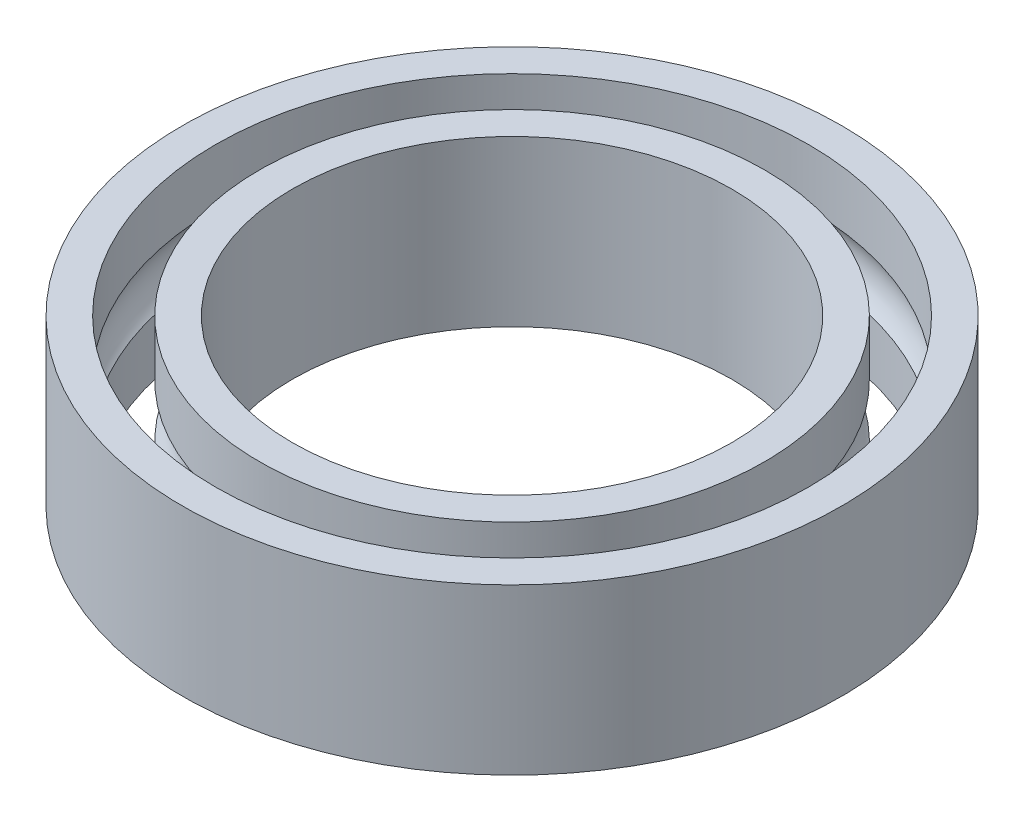
ISO-10303-21;
HEADER;
FILE_DESCRIPTION(('STEP AP214'),'2;1');
FILE_NAME('part.step','',(''),(''),'','','');
FILE_SCHEMA(('AUTOMOTIVE_DESIGN { 1 0 10303 214 1 1 1 1 }'));
ENDSEC;
DATA;
#1=APPLICATION_CONTEXT('core data for automotive mechanical design processes');
#2=APPLICATION_PROTOCOL_DEFINITION('international standard','automotive_design',2000,#1);
#3=PRODUCT_CONTEXT('',#1,'mechanical');
#4=PRODUCT('Part','Part','',(#3));
#5=PRODUCT_RELATED_PRODUCT_CATEGORY('part','',(#4));
#6=PRODUCT_DEFINITION_FORMATION('','',#4);
#7=PRODUCT_DEFINITION_CONTEXT('part definition',#1,'design');
#8=PRODUCT_DEFINITION('design','',#6,#7);
#9=PRODUCT_DEFINITION_SHAPE('','',#8);
#10=(LENGTH_UNIT() NAMED_UNIT(*) SI_UNIT(.MILLI.,.METRE.));
#11=(NAMED_UNIT(*) PLANE_ANGLE_UNIT() SI_UNIT($,.RADIAN.));
#12=(NAMED_UNIT(*) SI_UNIT($,.STERADIAN.) SOLID_ANGLE_UNIT());
#13=UNCERTAINTY_MEASURE_WITH_UNIT(LENGTH_MEASURE(1.E-05),#10,'distance_accuracy_value','');
#14=(GEOMETRIC_REPRESENTATION_CONTEXT(3) GLOBAL_UNCERTAINTY_ASSIGNED_CONTEXT((#13)) GLOBAL_UNIT_ASSIGNED_CONTEXT((#10,
#11,#12)) REPRESENTATION_CONTEXT('',''));
#15=CARTESIAN_POINT('',(0.,0.,0.));
#16=DIRECTION('',(0.,0.,1.));
#17=DIRECTION('',(1.,0.,0.));
#18=AXIS2_PLACEMENT_3D('',#15,#16,#17);
#19=CARTESIAN_POINT('',(0.,-7.4169874783919,0.));
#20=DIRECTION('',(0.,-1.,0.));
#21=DIRECTION('',(0.,0.,-1.));
#22=AXIS2_PLACEMENT_3D('',#19,#20,#21);
#23=CYLINDRICAL_SURFACE('',#22,4.);
#24=CARTESIAN_POINT('',(0.,-1.5,0.));
#25=DIRECTION('',(0.,-1.,0.));
#26=DIRECTION('',(0.,0.,-1.));
#27=AXIS2_PLACEMENT_3D('',#24,#25,#26);
#28=CIRCLE('',#27,4.);
#29=CARTESIAN_POINT('',(0.,-1.5,-4.));
#30=VERTEX_POINT('',#29);
#31=EDGE_CURVE('E11',#30,#30,#28,.T.);
#32=ORIENTED_EDGE('',*,*,#31,.T.);
#33=EDGE_LOOP('',(#32));
#34=FACE_BOUND('',#33,.T.);
#35=CARTESIAN_POINT('',(0.,1.5,0.));
#36=DIRECTION('',(0.,-1.,0.));
#37=DIRECTION('',(0.,0.,-1.));
#38=AXIS2_PLACEMENT_3D('',#35,#36,#37);
#39=CIRCLE('',#38,4.);
#40=CARTESIAN_POINT('',(0.,1.5,-4.));
#41=VERTEX_POINT('',#40);
#42=EDGE_CURVE('E67',#41,#41,#39,.T.);
#43=ORIENTED_EDGE('',*,*,#42,.F.);
#44=EDGE_LOOP('',(#43));
#45=FACE_BOUND('',#44,.T.);
#46=ADVANCED_FACE('F45',(#34,#45),#23,.F.);
#47=CARTESIAN_POINT('',(4.,-1.5,0.));
#48=DIRECTION('',(0.,-1.,0.));
#49=DIRECTION('',(0.,0.,-1.));
#50=AXIS2_PLACEMENT_3D('',#47,#48,#49);
#51=PLANE('',#50);
#52=CARTESIAN_POINT('',(0.,-1.5,0.));
#53=DIRECTION('',(0.,-1.,0.));
#54=DIRECTION('',(0.,0.,-1.));
#55=AXIS2_PLACEMENT_3D('',#52,#53,#54);
#56=CIRCLE('',#55,4.6);
#57=CARTESIAN_POINT('',(0.,-1.5,-4.6));
#58=VERTEX_POINT('',#57);
#59=EDGE_CURVE('E51',#58,#58,#56,.T.);
#60=ORIENTED_EDGE('',*,*,#59,.T.);
#61=EDGE_LOOP('',(#60));
#62=FACE_BOUND('',#61,.T.);
#63=ORIENTED_EDGE('',*,*,#31,.F.);
#64=EDGE_LOOP('',(#63));
#65=FACE_BOUND('',#64,.T.);
#66=ADVANCED_FACE('F75',(#62,#65),#51,.T.);
#67=CARTESIAN_POINT('',(0.,-7.4169874783919,0.));
#68=DIRECTION('',(0.,-1.,0.));
#69=DIRECTION('',(0.,0.,-1.));
#70=AXIS2_PLACEMENT_3D('',#67,#68,#69);
#71=CYLINDRICAL_SURFACE('',#70,4.6);
#72=CARTESIAN_POINT('',(0.,-0.480234317807463,0.));
#73=DIRECTION('',(0.,-1.,0.));
#74=DIRECTION('',(0.,0.,-1.));
#75=AXIS2_PLACEMENT_3D('',#72,#73,#74);
#76=CIRCLE('',#75,4.6);
#77=CARTESIAN_POINT('',(0.,-0.480234317807463,-4.6));
#78=VERTEX_POINT('',#77);
#79=EDGE_CURVE('E55',#78,#78,#76,.T.);
#80=ORIENTED_EDGE('',*,*,#79,.T.);
#81=EDGE_LOOP('',(#80));
#82=FACE_BOUND('',#81,.T.);
#83=ORIENTED_EDGE('',*,*,#59,.F.);
#84=EDGE_LOOP('',(#83));
#85=FACE_BOUND('',#84,.T.);
#86=ADVANCED_FACE('F79',(#82,#85),#71,.T.);
#87=CARTESIAN_POINT('',(0.,0.,0.));
#88=DIRECTION('',(0.,-1.,0.));
#89=DIRECTION('',(0.,0.,-1.));
#90=AXIS2_PLACEMENT_3D('',#87,#88,#89);
#91=TOROIDAL_SURFACE('',#90,5.,0.624999999999999);
#92=CARTESIAN_POINT('',(0.,0.480234317807462,0.));
#93=DIRECTION('',(0.,-1.,0.));
#94=DIRECTION('',(0.,0.,-1.));
#95=AXIS2_PLACEMENT_3D('',#92,#93,#94);
#96=CIRCLE('',#95,4.6);
#97=CARTESIAN_POINT('',(0.,0.480234317807462,-4.6));
#98=VERTEX_POINT('',#97);
#99=EDGE_CURVE('E59',#98,#98,#96,.T.);
#100=ORIENTED_EDGE('',*,*,#99,.T.);
#101=EDGE_LOOP('',(#100));
#102=FACE_BOUND('',#101,.T.);
#103=ORIENTED_EDGE('',*,*,#79,.F.);
#104=EDGE_LOOP('',(#103));
#105=FACE_BOUND('',#104,.T.);
#106=ADVANCED_FACE('F83',(#102,#105),#91,.F.);
#107=CARTESIAN_POINT('',(0.,-7.4169874783919,0.));
#108=DIRECTION('',(0.,-1.,0.));
#109=DIRECTION('',(0.,0.,-1.));
#110=AXIS2_PLACEMENT_3D('',#107,#108,#109);
#111=CYLINDRICAL_SURFACE('',#110,4.6);
#112=CARTESIAN_POINT('',(0.,1.5,0.));
#113=DIRECTION('',(0.,-1.,0.));
#114=DIRECTION('',(0.,0.,-1.));
#115=AXIS2_PLACEMENT_3D('',#112,#113,#114);
#116=CIRCLE('',#115,4.6);
#117=CARTESIAN_POINT('',(0.,1.5,-4.6));
#118=VERTEX_POINT('',#117);
#119=EDGE_CURVE('E64',#118,#118,#116,.T.);
#120=ORIENTED_EDGE('',*,*,#119,.T.);
#121=EDGE_LOOP('',(#120));
#122=FACE_BOUND('',#121,.T.);
#123=ORIENTED_EDGE('',*,*,#99,.F.);
#124=EDGE_LOOP('',(#123));
#125=FACE_BOUND('',#124,.T.);
#126=ADVANCED_FACE('F90',(#122,#125),#111,.T.);
#127=CARTESIAN_POINT('',(4.,1.5,0.));
#128=DIRECTION('',(0.,1.,0.));
#129=DIRECTION('',(0.,0.,1.));
#130=AXIS2_PLACEMENT_3D('',#127,#128,#129);
#131=PLANE('',#130);
#132=ORIENTED_EDGE('',*,*,#42,.T.);
#133=EDGE_LOOP('',(#132));
#134=FACE_BOUND('',#133,.T.);
#135=ORIENTED_EDGE('',*,*,#119,.F.);
#136=EDGE_LOOP('',(#135));
#137=FACE_BOUND('',#136,.T.);
#138=ADVANCED_FACE('F71',(#134,#137),#131,.T.);
#139=CLOSED_SHELL('',(#46,#66,#86,#106,#126,#138));
#140=MANIFOLD_SOLID_BREP('B2',#139);
#141=CARTESIAN_POINT('',(5.4,-1.5,0.));
#142=DIRECTION('',(0.,-1.,0.));
#143=DIRECTION('',(0.,0.,-1.));
#144=AXIS2_PLACEMENT_3D('',#141,#142,#143);
#145=PLANE('',#144);
#146=CARTESIAN_POINT('',(0.,-1.5,0.));
#147=DIRECTION('',(0.,-1.,0.));
#148=DIRECTION('',(0.,0.,-1.));
#149=AXIS2_PLACEMENT_3D('',#146,#147,#148);
#150=CIRCLE('',#149,6.);
#151=CARTESIAN_POINT('',(0.,-1.5,-6.));
#152=VERTEX_POINT('',#151);
#153=EDGE_CURVE('E44',#152,#152,#150,.T.);
#154=ORIENTED_EDGE('',*,*,#153,.T.);
#155=EDGE_LOOP('',(#154));
#156=FACE_BOUND('',#155,.T.);
#157=CARTESIAN_POINT('',(0.,-1.5,0.));
#158=DIRECTION('',(0.,-1.,0.));
#159=DIRECTION('',(0.,0.,-1.));
#160=AXIS2_PLACEMENT_3D('',#157,#158,#159);
#161=CIRCLE('',#160,5.4);
#162=CARTESIAN_POINT('',(0.,-1.5,-5.4));
#163=VERTEX_POINT('',#162);
#164=EDGE_CURVE('E164',#163,#163,#161,.T.);
#165=ORIENTED_EDGE('',*,*,#164,.F.);
#166=EDGE_LOOP('',(#165));
#167=FACE_BOUND('',#166,.T.);
#168=ADVANCED_FACE('F137',(#156,#167),#145,.T.);
#169=CARTESIAN_POINT('',(0.,-7.4169874783919,0.));
#170=DIRECTION('',(0.,-1.,0.));
#171=DIRECTION('',(0.,0.,-1.));
#172=AXIS2_PLACEMENT_3D('',#169,#170,#171);
#173=CYLINDRICAL_SURFACE('',#172,6.);
#174=CARTESIAN_POINT('',(0.,1.5,0.));
#175=DIRECTION('',(0.,-1.,0.));
#176=DIRECTION('',(0.,0.,-1.));
#177=AXIS2_PLACEMENT_3D('',#174,#175,#176);
#178=CIRCLE('',#177,6.);
#179=CARTESIAN_POINT('',(0.,1.5,-6.));
#180=VERTEX_POINT('',#179);
#181=EDGE_CURVE('E144',#180,#180,#178,.T.);
#182=ORIENTED_EDGE('',*,*,#181,.T.);
#183=EDGE_LOOP('',(#182));
#184=FACE_BOUND('',#183,.T.);
#185=ORIENTED_EDGE('',*,*,#153,.F.);
#186=EDGE_LOOP('',(#185));
#187=FACE_BOUND('',#186,.T.);
#188=ADVANCED_FACE('F173',(#184,#187),#173,.T.);
#189=CARTESIAN_POINT('',(5.4,1.5,0.));
#190=DIRECTION('',(0.,1.,0.));
#191=DIRECTION('',(0.,0.,1.));
#192=AXIS2_PLACEMENT_3D('',#189,#190,#191);
#193=PLANE('',#192);
#194=CARTESIAN_POINT('',(0.,1.5,0.));
#195=DIRECTION('',(0.,-1.,0.));
#196=DIRECTION('',(0.,0.,-1.));
#197=AXIS2_PLACEMENT_3D('',#194,#195,#196);
#198=CIRCLE('',#197,5.4);
#199=CARTESIAN_POINT('',(0.,1.5,-5.4));
#200=VERTEX_POINT('',#199);
#201=EDGE_CURVE('E149',#200,#200,#198,.T.);
#202=ORIENTED_EDGE('',*,*,#201,.T.);
#203=EDGE_LOOP('',(#202));
#204=FACE_BOUND('',#203,.T.);
#205=ORIENTED_EDGE('',*,*,#181,.F.);
#206=EDGE_LOOP('',(#205));
#207=FACE_BOUND('',#206,.T.);
#208=ADVANCED_FACE('F177',(#204,#207),#193,.T.);
#209=CARTESIAN_POINT('',(0.,-7.4169874783919,0.));
#210=DIRECTION('',(0.,-1.,0.));
#211=DIRECTION('',(0.,0.,-1.));
#212=AXIS2_PLACEMENT_3D('',#209,#210,#211);
#213=CYLINDRICAL_SURFACE('',#212,5.4);
#214=CARTESIAN_POINT('',(0.,0.480234317807462,0.));
#215=DIRECTION('',(0.,-1.,0.));
#216=DIRECTION('',(0.,0.,-1.));
#217=AXIS2_PLACEMENT_3D('',#214,#215,#216);
#218=CIRCLE('',#217,5.4);
#219=CARTESIAN_POINT('',(0.,0.480234317807462,-5.4));
#220=VERTEX_POINT('',#219);
#221=EDGE_CURVE('E154',#220,#220,#218,.T.);
#222=ORIENTED_EDGE('',*,*,#221,.T.);
#223=EDGE_LOOP('',(#222));
#224=FACE_BOUND('',#223,.T.);
#225=ORIENTED_EDGE('',*,*,#201,.F.);
#226=EDGE_LOOP('',(#225));
#227=FACE_BOUND('',#226,.T.);
#228=ADVANCED_FACE('F181',(#224,#227),#213,.F.);
#229=CARTESIAN_POINT('',(0.,0.,0.));
#230=DIRECTION('',(0.,-1.,0.));
#231=DIRECTION('',(0.,0.,-1.));
#232=AXIS2_PLACEMENT_3D('',#229,#230,#231);
#233=TOROIDAL_SURFACE('',#232,5.,0.624999999999999);
#234=CARTESIAN_POINT('',(0.,-0.480234317807463,0.));
#235=DIRECTION('',(0.,-1.,0.));
#236=DIRECTION('',(0.,0.,-1.));
#237=AXIS2_PLACEMENT_3D('',#234,#235,#236);
#238=CIRCLE('',#237,5.4);
#239=CARTESIAN_POINT('',(0.,-0.480234317807463,-5.4));
#240=VERTEX_POINT('',#239);
#241=EDGE_CURVE('E160',#240,#240,#238,.T.);
#242=ORIENTED_EDGE('',*,*,#241,.T.);
#243=EDGE_LOOP('',(#242));
#244=FACE_BOUND('',#243,.T.);
#245=ORIENTED_EDGE('',*,*,#221,.F.);
#246=EDGE_LOOP('',(#245));
#247=FACE_BOUND('',#246,.T.);
#248=ADVANCED_FACE('F188',(#244,#247),#233,.F.);
#249=CARTESIAN_POINT('',(0.,-7.4169874783919,0.));
#250=DIRECTION('',(0.,-1.,0.));
#251=DIRECTION('',(0.,0.,-1.));
#252=AXIS2_PLACEMENT_3D('',#249,#250,#251);
#253=CYLINDRICAL_SURFACE('',#252,5.4);
#254=ORIENTED_EDGE('',*,*,#164,.T.);
#255=EDGE_LOOP('',(#254));
#256=FACE_BOUND('',#255,.T.);
#257=ORIENTED_EDGE('',*,*,#241,.F.);
#258=EDGE_LOOP('',(#257));
#259=FACE_BOUND('',#258,.T.);
#260=ADVANCED_FACE('F169',(#256,#259),#253,.F.);
#261=CLOSED_SHELL('',(#168,#188,#208,#228,#248,#260));
#262=MANIFOLD_SOLID_BREP('B6',#261);
#263=ADVANCED_BREP_SHAPE_REPRESENTATION('',(#18,#140,#262),#14);
#264=SHAPE_DEFINITION_REPRESENTATION(#9,#263);
ENDSEC;
END-ISO-10303-21;
